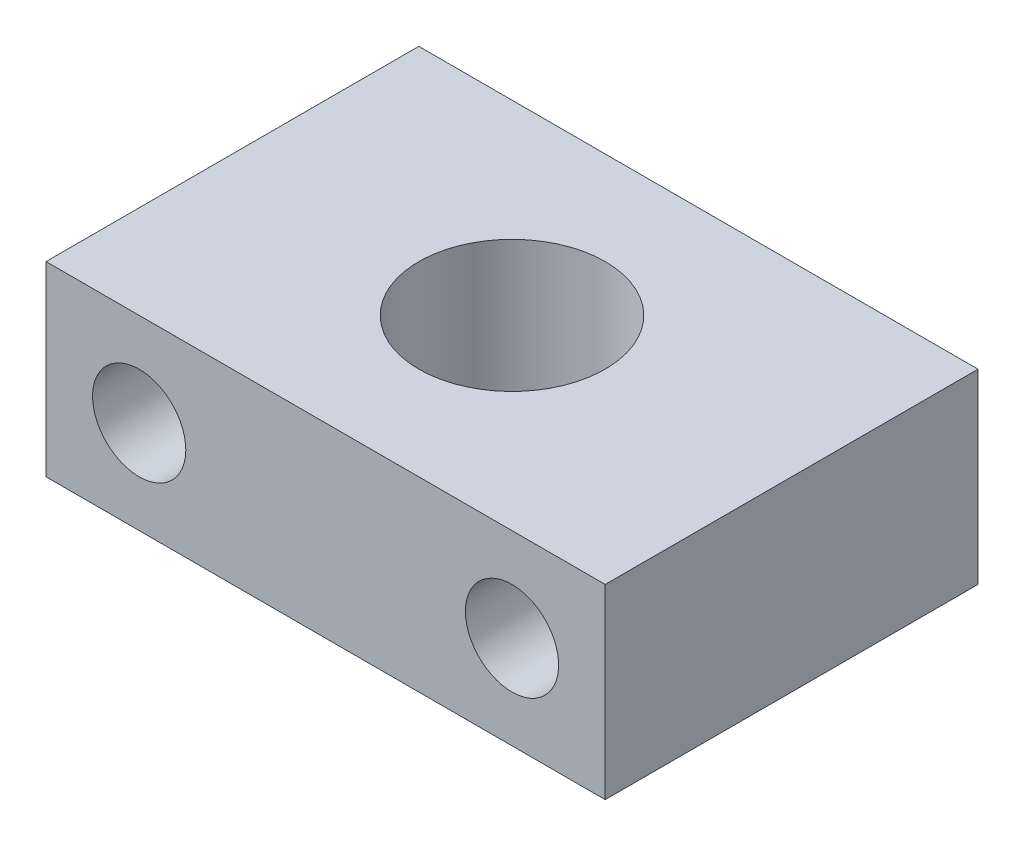
ISO-10303-21;
HEADER;
FILE_DESCRIPTION(('STEP AP214'),'2;1');
FILE_NAME('part.step','',(''),(''),'','','');
FILE_SCHEMA(('AUTOMOTIVE_DESIGN { 1 0 10303 214 1 1 1 1 }'));
ENDSEC;
DATA;
#1=APPLICATION_CONTEXT('core data for automotive mechanical design processes');
#2=APPLICATION_PROTOCOL_DEFINITION('international standard','automotive_design',2000,#1);
#3=PRODUCT_CONTEXT('',#1,'mechanical');
#4=PRODUCT('Part','Part','',(#3));
#5=PRODUCT_RELATED_PRODUCT_CATEGORY('part','',(#4));
#6=PRODUCT_DEFINITION_FORMATION('','',#4);
#7=PRODUCT_DEFINITION_CONTEXT('part definition',#1,'design');
#8=PRODUCT_DEFINITION('design','',#6,#7);
#9=PRODUCT_DEFINITION_SHAPE('','',#8);
#10=(LENGTH_UNIT() NAMED_UNIT(*) SI_UNIT(.MILLI.,.METRE.));
#11=(NAMED_UNIT(*) PLANE_ANGLE_UNIT() SI_UNIT($,.RADIAN.));
#12=(NAMED_UNIT(*) SI_UNIT($,.STERADIAN.) SOLID_ANGLE_UNIT());
#13=UNCERTAINTY_MEASURE_WITH_UNIT(LENGTH_MEASURE(1.E-05),#10,'distance_accuracy_value','');
#14=(GEOMETRIC_REPRESENTATION_CONTEXT(3) GLOBAL_UNCERTAINTY_ASSIGNED_CONTEXT((#13)) GLOBAL_UNIT_ASSIGNED_CONTEXT((#10,
#11,#12)) REPRESENTATION_CONTEXT('',''));
#15=CARTESIAN_POINT('',(0.,0.,0.));
#16=DIRECTION('',(0.,0.,1.));
#17=DIRECTION('',(1.,0.,0.));
#18=AXIS2_PLACEMENT_3D('',#15,#16,#17);
#19=CARTESIAN_POINT('',(19.05,12.7,-12.7));
#20=DIRECTION('',(-1.,0.,0.));
#21=DIRECTION('',(0.,0.,1.));
#22=AXIS2_PLACEMENT_3D('',#19,#20,#21);
#23=PLANE('',#22);
#24=DIRECTION('',(0.,0.,-1.));
#25=VECTOR('',#24,1.);
#26=CARTESIAN_POINT('',(19.05,0.,-12.7));
#27=LINE('',#26,#25);
#28=CARTESIAN_POINT('',(19.05,0.,12.7));
#29=VERTEX_POINT('',#28);
#30=CARTESIAN_POINT('',(19.05,0.,-12.7));
#31=VERTEX_POINT('',#30);
#32=EDGE_CURVE('E102',#29,#31,#27,.T.);
#33=ORIENTED_EDGE('',*,*,#32,.T.);
#34=DIRECTION('',(0.,-1.,0.));
#35=VECTOR('',#34,1.);
#36=CARTESIAN_POINT('',(19.05,12.7,-12.7));
#37=LINE('',#36,#35);
#38=CARTESIAN_POINT('',(19.05,12.7,-12.7));
#39=VERTEX_POINT('',#38);
#40=EDGE_CURVE('E11',#39,#31,#37,.T.);
#41=ORIENTED_EDGE('',*,*,#40,.F.);
#42=DIRECTION('',(0.,0.,-1.));
#43=VECTOR('',#42,1.);
#44=CARTESIAN_POINT('',(19.05,12.7,-12.7));
#45=LINE('',#44,#43);
#46=CARTESIAN_POINT('',(19.05,12.7,12.7));
#47=VERTEX_POINT('',#46);
#48=EDGE_CURVE('E90',#47,#39,#45,.T.);
#49=ORIENTED_EDGE('',*,*,#48,.F.);
#50=DIRECTION('',(0.,-1.,0.));
#51=VECTOR('',#50,1.);
#52=CARTESIAN_POINT('',(19.05,12.7,12.7));
#53=LINE('',#52,#51);
#54=EDGE_CURVE('E98',#47,#29,#53,.T.);
#55=ORIENTED_EDGE('',*,*,#54,.T.);
#56=EDGE_LOOP('',(#33,#41,#49,#55));
#57=FACE_BOUND('',#56,.T.);
#58=ADVANCED_FACE('F39',(#57),#23,.F.);
#59=CARTESIAN_POINT('',(-19.05,12.7,-12.7));
#60=DIRECTION('',(0.,0.,1.));
#61=DIRECTION('',(1.,0.,0.));
#62=AXIS2_PLACEMENT_3D('',#59,#60,#61);
#63=PLANE('',#62);
#64=CARTESIAN_POINT('',(12.7,6.35,-12.7));
#65=DIRECTION('',(0.,0.,-1.));
#66=DIRECTION('',(-1.,0.,0.));
#67=AXIS2_PLACEMENT_3D('',#64,#65,#66);
#68=CIRCLE('',#67,3.175);
#69=CARTESIAN_POINT('',(9.525,6.35,-12.7));
#70=VERTEX_POINT('',#69);
#71=EDGE_CURVE('E128',#70,#70,#68,.T.);
#72=ORIENTED_EDGE('',*,*,#71,.F.);
#73=EDGE_LOOP('',(#72));
#74=FACE_BOUND('',#73,.T.);
#75=CARTESIAN_POINT('',(-12.7,6.35000000000002,-12.7));
#76=DIRECTION('',(0.,0.,-1.));
#77=DIRECTION('',(1.,0.,0.));
#78=AXIS2_PLACEMENT_3D('',#75,#76,#77);
#79=CIRCLE('',#78,3.175);
#80=CARTESIAN_POINT('',(-9.52499999999999,6.35000000000002,-12.7));
#81=VERTEX_POINT('',#80);
#82=EDGE_CURVE('E125',#81,#81,#79,.T.);
#83=ORIENTED_EDGE('',*,*,#82,.F.);
#84=EDGE_LOOP('',(#83));
#85=FACE_BOUND('',#84,.T.);
#86=DIRECTION('',(-1.,0.,0.));
#87=VECTOR('',#86,1.);
#88=CARTESIAN_POINT('',(-19.05,0.,-12.7));
#89=LINE('',#88,#87);
#90=CARTESIAN_POINT('',(-19.05,0.,-12.7));
#91=VERTEX_POINT('',#90);
#92=EDGE_CURVE('E94',#31,#91,#89,.T.);
#93=ORIENTED_EDGE('',*,*,#92,.T.);
#94=DIRECTION('',(0.,-1.,0.));
#95=VECTOR('',#94,1.);
#96=CARTESIAN_POINT('',(-19.05,12.7,-12.7));
#97=LINE('',#96,#95);
#98=CARTESIAN_POINT('',(-19.05,12.7,-12.7));
#99=VERTEX_POINT('',#98);
#100=EDGE_CURVE('E47',#99,#91,#97,.T.);
#101=ORIENTED_EDGE('',*,*,#100,.F.);
#102=DIRECTION('',(-1.,0.,0.));
#103=VECTOR('',#102,1.);
#104=CARTESIAN_POINT('',(-19.05,12.7,-12.7));
#105=LINE('',#104,#103);
#106=EDGE_CURVE('E85',#39,#99,#105,.T.);
#107=ORIENTED_EDGE('',*,*,#106,.F.);
#108=ORIENTED_EDGE('',*,*,#40,.T.);
#109=EDGE_LOOP('',(#93,#101,#107,#108));
#110=FACE_BOUND('',#109,.T.);
#111=ADVANCED_FACE('F93',(#74,#85,#110),#63,.F.);
#112=CARTESIAN_POINT('',(-19.05,12.7,-12.7));
#113=DIRECTION('',(1.,0.,0.));
#114=DIRECTION('',(0.,0.,-1.));
#115=AXIS2_PLACEMENT_3D('',#112,#113,#114);
#116=PLANE('',#115);
#117=DIRECTION('',(0.,0.,1.));
#118=VECTOR('',#117,1.);
#119=CARTESIAN_POINT('',(-19.05,0.,-12.7));
#120=LINE('',#119,#118);
#121=CARTESIAN_POINT('',(-19.05,0.,12.7));
#122=VERTEX_POINT('',#121);
#123=EDGE_CURVE('E72',#91,#122,#120,.T.);
#124=ORIENTED_EDGE('',*,*,#123,.T.);
#125=DIRECTION('',(0.,-1.,0.));
#126=VECTOR('',#125,1.);
#127=CARTESIAN_POINT('',(-19.05,12.7,12.7));
#128=LINE('',#127,#126);
#129=CARTESIAN_POINT('',(-19.05,12.7,12.7));
#130=VERTEX_POINT('',#129);
#131=EDGE_CURVE('E95',#130,#122,#128,.T.);
#132=ORIENTED_EDGE('',*,*,#131,.F.);
#133=DIRECTION('',(0.,0.,1.));
#134=VECTOR('',#133,1.);
#135=CARTESIAN_POINT('',(-19.05,12.7,-12.7));
#136=LINE('',#135,#134);
#137=EDGE_CURVE('E88',#99,#130,#136,.T.);
#138=ORIENTED_EDGE('',*,*,#137,.F.);
#139=ORIENTED_EDGE('',*,*,#100,.T.);
#140=EDGE_LOOP('',(#124,#132,#138,#139));
#141=FACE_BOUND('',#140,.T.);
#142=ADVANCED_FACE('F96',(#141),#116,.F.);
#143=CARTESIAN_POINT('',(-19.05,12.7,12.7));
#144=DIRECTION('',(0.,0.,-1.));
#145=DIRECTION('',(-1.,0.,0.));
#146=AXIS2_PLACEMENT_3D('',#143,#144,#145);
#147=PLANE('',#146);
#148=CARTESIAN_POINT('',(12.7,6.35,12.7));
#149=DIRECTION('',(0.,0.,-1.));
#150=DIRECTION('',(-1.,0.,0.));
#151=AXIS2_PLACEMENT_3D('',#148,#149,#150);
#152=CIRCLE('',#151,3.175);
#153=CARTESIAN_POINT('',(9.525,6.35,12.7));
#154=VERTEX_POINT('',#153);
#155=EDGE_CURVE('E119',#154,#154,#152,.T.);
#156=ORIENTED_EDGE('',*,*,#155,.T.);
#157=EDGE_LOOP('',(#156));
#158=FACE_BOUND('',#157,.T.);
#159=CARTESIAN_POINT('',(-12.7,6.35000000000002,12.7));
#160=DIRECTION('',(0.,0.,-1.));
#161=DIRECTION('',(1.,0.,0.));
#162=AXIS2_PLACEMENT_3D('',#159,#160,#161);
#163=CIRCLE('',#162,3.175);
#164=CARTESIAN_POINT('',(-9.52499999999999,6.35000000000002,12.7));
#165=VERTEX_POINT('',#164);
#166=EDGE_CURVE('E122',#165,#165,#163,.T.);
#167=ORIENTED_EDGE('',*,*,#166,.T.);
#168=EDGE_LOOP('',(#167));
#169=FACE_BOUND('',#168,.T.);
#170=DIRECTION('',(1.,0.,0.));
#171=VECTOR('',#170,1.);
#172=CARTESIAN_POINT('',(-19.05,0.,12.7));
#173=LINE('',#172,#171);
#174=EDGE_CURVE('E78',#122,#29,#173,.T.);
#175=ORIENTED_EDGE('',*,*,#174,.T.);
#176=ORIENTED_EDGE('',*,*,#54,.F.);
#177=DIRECTION('',(1.,0.,0.));
#178=VECTOR('',#177,1.);
#179=CARTESIAN_POINT('',(-19.05,12.7,12.7));
#180=LINE('',#179,#178);
#181=EDGE_CURVE('E55',#130,#47,#180,.T.);
#182=ORIENTED_EDGE('',*,*,#181,.F.);
#183=ORIENTED_EDGE('',*,*,#131,.T.);
#184=EDGE_LOOP('',(#175,#176,#182,#183));
#185=FACE_BOUND('',#184,.T.);
#186=ADVANCED_FACE('F110',(#158,#169,#185),#147,.F.);
#187=CARTESIAN_POINT('',(0.,12.7,0.));
#188=DIRECTION('',(0.,1.,0.));
#189=DIRECTION('',(0.,0.,1.));
#190=AXIS2_PLACEMENT_3D('',#187,#188,#189);
#191=PLANE('',#190);
#192=CARTESIAN_POINT('',(0.,12.7,0.));
#193=DIRECTION('',(0.,1.,0.));
#194=DIRECTION('',(0.,0.,1.));
#195=AXIS2_PLACEMENT_3D('',#192,#193,#194);
#196=CIRCLE('',#195,6.35);
#197=CARTESIAN_POINT('',(0.,12.7,6.35));
#198=VERTEX_POINT('',#197);
#199=EDGE_CURVE('E116',#198,#198,#196,.T.);
#200=ORIENTED_EDGE('',*,*,#199,.F.);
#201=EDGE_LOOP('',(#200));
#202=FACE_BOUND('',#201,.T.);
#203=ORIENTED_EDGE('',*,*,#48,.T.);
#204=ORIENTED_EDGE('',*,*,#106,.T.);
#205=ORIENTED_EDGE('',*,*,#137,.T.);
#206=ORIENTED_EDGE('',*,*,#181,.T.);
#207=EDGE_LOOP('',(#203,#204,#205,#206));
#208=FACE_BOUND('',#207,.T.);
#209=ADVANCED_FACE('F86',(#202,#208),#191,.T.);
#210=CARTESIAN_POINT('',(0.,0.,0.));
#211=DIRECTION('',(0.,1.,0.));
#212=DIRECTION('',(0.,0.,1.));
#213=AXIS2_PLACEMENT_3D('',#210,#211,#212);
#214=PLANE('',#213);
#215=CARTESIAN_POINT('',(0.,0.,0.));
#216=DIRECTION('',(0.,1.,0.));
#217=DIRECTION('',(0.,0.,1.));
#218=AXIS2_PLACEMENT_3D('',#215,#216,#217);
#219=CIRCLE('',#218,6.35);
#220=CARTESIAN_POINT('',(0.,0.,6.35));
#221=VERTEX_POINT('',#220);
#222=EDGE_CURVE('E105',#221,#221,#219,.T.);
#223=ORIENTED_EDGE('',*,*,#222,.T.);
#224=EDGE_LOOP('',(#223));
#225=FACE_BOUND('',#224,.T.);
#226=ORIENTED_EDGE('',*,*,#32,.F.);
#227=ORIENTED_EDGE('',*,*,#174,.F.);
#228=ORIENTED_EDGE('',*,*,#123,.F.);
#229=ORIENTED_EDGE('',*,*,#92,.F.);
#230=EDGE_LOOP('',(#226,#227,#228,#229));
#231=FACE_BOUND('',#230,.T.);
#232=ADVANCED_FACE('F113',(#225,#231),#214,.F.);
#233=CARTESIAN_POINT('',(0.,0.,0.));
#234=DIRECTION('',(0.,1.,0.));
#235=DIRECTION('',(0.,0.,1.));
#236=AXIS2_PLACEMENT_3D('',#233,#234,#235);
#237=CYLINDRICAL_SURFACE('',#236,6.35);
#238=ORIENTED_EDGE('',*,*,#222,.F.);
#239=EDGE_LOOP('',(#238));
#240=FACE_BOUND('',#239,.T.);
#241=ORIENTED_EDGE('',*,*,#199,.T.);
#242=EDGE_LOOP('',(#241));
#243=FACE_BOUND('',#242,.T.);
#244=ADVANCED_FACE('F148',(#240,#243),#237,.F.);
#245=CARTESIAN_POINT('',(-12.7,6.35000000000002,12.7));
#246=DIRECTION('',(0.,0.,-1.));
#247=DIRECTION('',(-1.,0.,0.));
#248=AXIS2_PLACEMENT_3D('',#245,#246,#247);
#249=CYLINDRICAL_SURFACE('',#248,3.175);
#250=ORIENTED_EDGE('',*,*,#166,.F.);
#251=EDGE_LOOP('',(#250));
#252=FACE_BOUND('',#251,.T.);
#253=ORIENTED_EDGE('',*,*,#82,.T.);
#254=EDGE_LOOP('',(#253));
#255=FACE_BOUND('',#254,.T.);
#256=ADVANCED_FACE('F139',(#252,#255),#249,.F.);
#257=CARTESIAN_POINT('',(12.7,6.35,12.7));
#258=DIRECTION('',(0.,0.,-1.));
#259=DIRECTION('',(-1.,0.,0.));
#260=AXIS2_PLACEMENT_3D('',#257,#258,#259);
#261=CYLINDRICAL_SURFACE('',#260,3.175);
#262=ORIENTED_EDGE('',*,*,#155,.F.);
#263=EDGE_LOOP('',(#262));
#264=FACE_BOUND('',#263,.T.);
#265=ORIENTED_EDGE('',*,*,#71,.T.);
#266=EDGE_LOOP('',(#265));
#267=FACE_BOUND('',#266,.T.);
#268=ADVANCED_FACE('F136',(#264,#267),#261,.F.);
#269=CLOSED_SHELL('',(#58,#111,#142,#186,#209,#232,#244,#256,#268));
#270=MANIFOLD_SOLID_BREP('B2',#269);
#271=ADVANCED_BREP_SHAPE_REPRESENTATION('',(#18,#270),#14);
#272=SHAPE_DEFINITION_REPRESENTATION(#9,#271);
ENDSEC;
END-ISO-10303-21;
